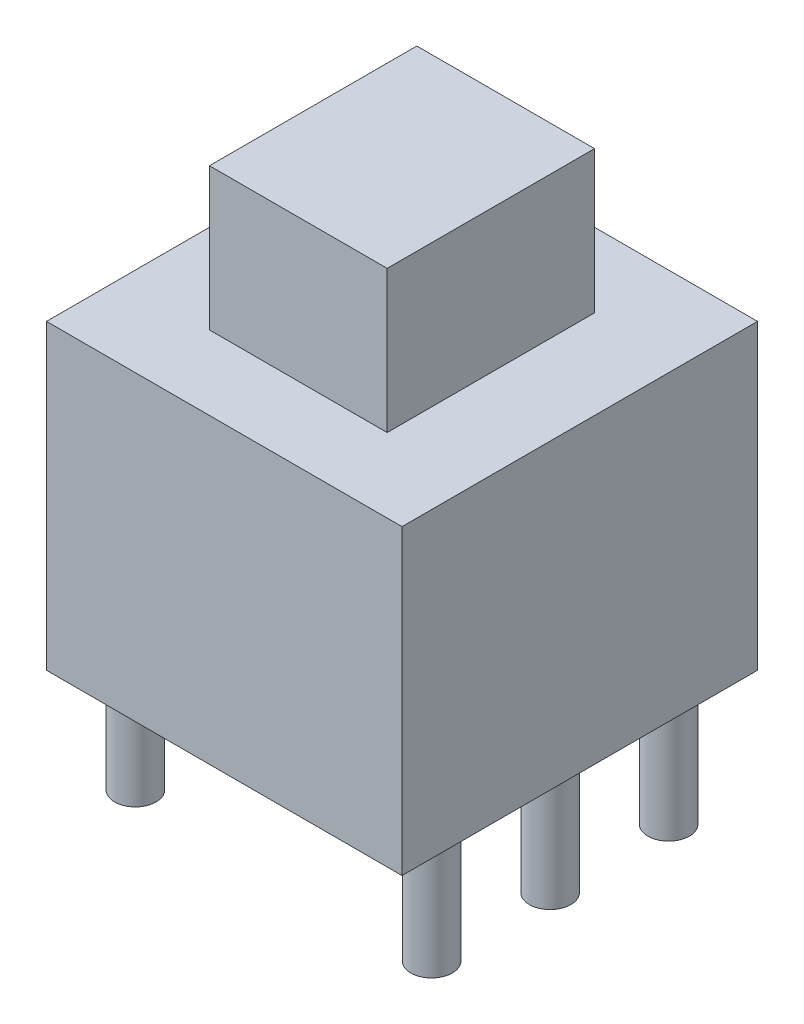
ISO-10303-21;
HEADER;
FILE_DESCRIPTION(('STEP AP214'),'2;1');
FILE_NAME('part.step','',(''),(''),'','','');
FILE_SCHEMA(('AUTOMOTIVE_DESIGN { 1 0 10303 214 1 1 1 1 }'));
ENDSEC;
DATA;
#1=APPLICATION_CONTEXT('core data for automotive mechanical design processes');
#2=APPLICATION_PROTOCOL_DEFINITION('international standard','automotive_design',2000,#1);
#3=PRODUCT_CONTEXT('',#1,'mechanical');
#4=PRODUCT('Part','Part','',(#3));
#5=PRODUCT_RELATED_PRODUCT_CATEGORY('part','',(#4));
#6=PRODUCT_DEFINITION_FORMATION('','',#4);
#7=PRODUCT_DEFINITION_CONTEXT('part definition',#1,'design');
#8=PRODUCT_DEFINITION('design','',#6,#7);
#9=PRODUCT_DEFINITION_SHAPE('','',#8);
#10=(LENGTH_UNIT() NAMED_UNIT(*) SI_UNIT(.MILLI.,.METRE.));
#11=(NAMED_UNIT(*) PLANE_ANGLE_UNIT() SI_UNIT($,.RADIAN.));
#12=(NAMED_UNIT(*) SI_UNIT($,.STERADIAN.) SOLID_ANGLE_UNIT());
#13=UNCERTAINTY_MEASURE_WITH_UNIT(LENGTH_MEASURE(1.E-05),#10,'distance_accuracy_value','');
#14=(GEOMETRIC_REPRESENTATION_CONTEXT(3) GLOBAL_UNCERTAINTY_ASSIGNED_CONTEXT((#13)) GLOBAL_UNIT_ASSIGNED_CONTEXT((#10,
#11,#12)) REPRESENTATION_CONTEXT('',''));
#15=CARTESIAN_POINT('',(0.,0.,0.));
#16=DIRECTION('',(0.,0.,1.));
#17=DIRECTION('',(1.,0.,0.));
#18=AXIS2_PLACEMENT_3D('',#15,#16,#17);
#19=CARTESIAN_POINT('',(0.,5.1,0.));
#20=DIRECTION('',(0.,-1.,0.));
#21=DIRECTION('',(0.,0.,-1.));
#22=AXIS2_PLACEMENT_3D('',#19,#20,#21);
#23=PLANE('',#22);
#24=DIRECTION('',(0.,0.,-1.));
#25=VECTOR('',#24,1.);
#26=CARTESIAN_POINT('',(3.,5.1,3.));
#27=LINE('',#26,#25);
#28=CARTESIAN_POINT('',(3.,5.1,3.));
#29=VERTEX_POINT('',#28);
#30=CARTESIAN_POINT('',(3.,5.1,-3.));
#31=VERTEX_POINT('',#30);
#32=EDGE_CURVE('E143',#29,#31,#27,.T.);
#33=ORIENTED_EDGE('',*,*,#32,.T.);
#34=DIRECTION('',(-1.,0.,0.));
#35=VECTOR('',#34,1.);
#36=CARTESIAN_POINT('',(-3.,5.1,-3.));
#37=LINE('',#36,#35);
#38=CARTESIAN_POINT('',(-3.,5.1,-3.));
#39=VERTEX_POINT('',#38);
#40=EDGE_CURVE('E147',#31,#39,#37,.T.);
#41=ORIENTED_EDGE('',*,*,#40,.T.);
#42=DIRECTION('',(0.,0.,1.));
#43=VECTOR('',#42,1.);
#44=CARTESIAN_POINT('',(-3.,5.1,3.));
#45=LINE('',#44,#43);
#46=CARTESIAN_POINT('',(-3.,5.1,3.));
#47=VERTEX_POINT('',#46);
#48=EDGE_CURVE('E151',#39,#47,#45,.T.);
#49=ORIENTED_EDGE('',*,*,#48,.T.);
#50=DIRECTION('',(1.,0.,0.));
#51=VECTOR('',#50,1.);
#52=CARTESIAN_POINT('',(-3.,5.1,3.));
#53=LINE('',#52,#51);
#54=EDGE_CURVE('E154',#47,#29,#53,.T.);
#55=ORIENTED_EDGE('',*,*,#54,.T.);
#56=EDGE_LOOP('',(#33,#41,#49,#55));
#57=FACE_BOUND('',#56,.T.);
#58=DIRECTION('',(0.,0.,-1.));
#59=VECTOR('',#58,1.);
#60=CARTESIAN_POINT('',(1.5,5.1,1.75));
#61=LINE('',#60,#59);
#62=CARTESIAN_POINT('',(1.5,5.1,1.75));
#63=VERTEX_POINT('',#62);
#64=CARTESIAN_POINT('',(1.5,5.1,-1.75000000000001));
#65=VERTEX_POINT('',#64);
#66=EDGE_CURVE('E59',#63,#65,#61,.T.);
#67=ORIENTED_EDGE('',*,*,#66,.F.);
#68=DIRECTION('',(1.,0.,0.));
#69=VECTOR('',#68,1.);
#70=CARTESIAN_POINT('',(-1.5,5.1,1.75));
#71=LINE('',#70,#69);
#72=CARTESIAN_POINT('',(-1.5,5.1,1.75));
#73=VERTEX_POINT('',#72);
#74=EDGE_CURVE('E63',#73,#63,#71,.T.);
#75=ORIENTED_EDGE('',*,*,#74,.F.);
#76=DIRECTION('',(0.,0.,1.));
#77=VECTOR('',#76,1.);
#78=CARTESIAN_POINT('',(-1.5,5.1,1.75));
#79=LINE('',#78,#77);
#80=CARTESIAN_POINT('',(-1.5,5.1,-1.75000000000001));
#81=VERTEX_POINT('',#80);
#82=EDGE_CURVE('E510',#81,#73,#79,.T.);
#83=ORIENTED_EDGE('',*,*,#82,.F.);
#84=DIRECTION('',(-1.,0.,0.));
#85=VECTOR('',#84,1.);
#86=CARTESIAN_POINT('',(-1.5,5.1,-1.75000000000001));
#87=LINE('',#86,#85);
#88=EDGE_CURVE('E507',#65,#81,#87,.T.);
#89=ORIENTED_EDGE('',*,*,#88,.F.);
#90=EDGE_LOOP('',(#67,#75,#83,#89));
#91=FACE_BOUND('',#90,.T.);
#92=ADVANCED_FACE('F43',(#57,#91),#23,.F.);
#93=CARTESIAN_POINT('',(3.,5.1,3.));
#94=DIRECTION('',(-1.,0.,0.));
#95=DIRECTION('',(0.,0.,1.));
#96=AXIS2_PLACEMENT_3D('',#93,#94,#95);
#97=PLANE('',#96);
#98=DIRECTION('',(0.,0.,-1.));
#99=VECTOR('',#98,1.);
#100=CARTESIAN_POINT('',(3.,0.,3.));
#101=LINE('',#100,#99);
#102=CARTESIAN_POINT('',(3.,0.,3.));
#103=VERTEX_POINT('',#102);
#104=CARTESIAN_POINT('',(3.,0.,-3.));
#105=VERTEX_POINT('',#104);
#106=EDGE_CURVE('E132',#103,#105,#101,.T.);
#107=ORIENTED_EDGE('',*,*,#106,.T.);
#108=DIRECTION('',(0.,-1.,0.));
#109=VECTOR('',#108,1.);
#110=CARTESIAN_POINT('',(3.,5.1,-3.));
#111=LINE('',#110,#109);
#112=EDGE_CURVE('E11',#31,#105,#111,.T.);
#113=ORIENTED_EDGE('',*,*,#112,.F.);
#114=ORIENTED_EDGE('',*,*,#32,.F.);
#115=DIRECTION('',(0.,-1.,0.));
#116=VECTOR('',#115,1.);
#117=CARTESIAN_POINT('',(3.,5.1,3.));
#118=LINE('',#117,#116);
#119=EDGE_CURVE('E156',#29,#103,#118,.T.);
#120=ORIENTED_EDGE('',*,*,#119,.T.);
#121=EDGE_LOOP('',(#107,#113,#114,#120));
#122=FACE_BOUND('',#121,.T.);
#123=ADVANCED_FACE('F45',(#122),#97,.F.);
#124=CARTESIAN_POINT('',(-3.,5.1,-3.));
#125=DIRECTION('',(0.,0.,1.));
#126=DIRECTION('',(1.,0.,0.));
#127=AXIS2_PLACEMENT_3D('',#124,#125,#126);
#128=PLANE('',#127);
#129=DIRECTION('',(-1.,0.,0.));
#130=VECTOR('',#129,1.);
#131=CARTESIAN_POINT('',(-3.,0.,-3.));
#132=LINE('',#131,#130);
#133=CARTESIAN_POINT('',(-3.,0.,-3.));
#134=VERTEX_POINT('',#133);
#135=EDGE_CURVE('E137',#105,#134,#132,.T.);
#136=ORIENTED_EDGE('',*,*,#135,.T.);
#137=DIRECTION('',(0.,-1.,0.));
#138=VECTOR('',#137,1.);
#139=CARTESIAN_POINT('',(-3.,5.1,-3.));
#140=LINE('',#139,#138);
#141=EDGE_CURVE('E52',#39,#134,#140,.T.);
#142=ORIENTED_EDGE('',*,*,#141,.F.);
#143=ORIENTED_EDGE('',*,*,#40,.F.);
#144=ORIENTED_EDGE('',*,*,#112,.T.);
#145=EDGE_LOOP('',(#136,#142,#143,#144));
#146=FACE_BOUND('',#145,.T.);
#147=ADVANCED_FACE('F192',(#146),#128,.F.);
#148=CARTESIAN_POINT('',(-3.,5.1,3.));
#149=DIRECTION('',(1.,0.,0.));
#150=DIRECTION('',(0.,0.,-1.));
#151=AXIS2_PLACEMENT_3D('',#148,#149,#150);
#152=PLANE('',#151);
#153=DIRECTION('',(0.,0.,1.));
#154=VECTOR('',#153,1.);
#155=CARTESIAN_POINT('',(-3.,0.,3.));
#156=LINE('',#155,#154);
#157=CARTESIAN_POINT('',(-3.,0.,3.));
#158=VERTEX_POINT('',#157);
#159=EDGE_CURVE('E160',#134,#158,#156,.T.);
#160=ORIENTED_EDGE('',*,*,#159,.T.);
#161=DIRECTION('',(0.,-1.,0.));
#162=VECTOR('',#161,1.);
#163=CARTESIAN_POINT('',(-3.,5.1,3.));
#164=LINE('',#163,#162);
#165=EDGE_CURVE('E168',#47,#158,#164,.T.);
#166=ORIENTED_EDGE('',*,*,#165,.F.);
#167=ORIENTED_EDGE('',*,*,#48,.F.);
#168=ORIENTED_EDGE('',*,*,#141,.T.);
#169=EDGE_LOOP('',(#160,#166,#167,#168));
#170=FACE_BOUND('',#169,.T.);
#171=ADVANCED_FACE('F177',(#170),#152,.F.);
#172=CARTESIAN_POINT('',(-3.,5.1,3.));
#173=DIRECTION('',(0.,0.,-1.));
#174=DIRECTION('',(-1.,0.,0.));
#175=AXIS2_PLACEMENT_3D('',#172,#173,#174);
#176=PLANE('',#175);
#177=DIRECTION('',(1.,0.,0.));
#178=VECTOR('',#177,1.);
#179=CARTESIAN_POINT('',(-3.,0.,3.));
#180=LINE('',#179,#178);
#181=EDGE_CURVE('E148',#158,#103,#180,.T.);
#182=ORIENTED_EDGE('',*,*,#181,.T.);
#183=ORIENTED_EDGE('',*,*,#119,.F.);
#184=ORIENTED_EDGE('',*,*,#54,.F.);
#185=ORIENTED_EDGE('',*,*,#165,.T.);
#186=EDGE_LOOP('',(#182,#183,#184,#185));
#187=FACE_BOUND('',#186,.T.);
#188=ADVANCED_FACE('F186',(#187),#176,.F.);
#189=CARTESIAN_POINT('',(0.,0.,0.));
#190=DIRECTION('',(0.,-1.,0.));
#191=DIRECTION('',(0.,0.,-1.));
#192=AXIS2_PLACEMENT_3D('',#189,#190,#191);
#193=PLANE('',#192);
#194=CARTESIAN_POINT('',(2.5,0.,2.));
#195=DIRECTION('',(0.,-1.,0.));
#196=DIRECTION('',(0.,0.,1.));
#197=AXIS2_PLACEMENT_3D('',#194,#195,#196);
#198=CIRCLE('',#197,0.35);
#199=CARTESIAN_POINT('',(2.5,0.,2.35));
#200=VERTEX_POINT('',#199);
#201=EDGE_CURVE('E454',#200,#200,#198,.T.);
#202=ORIENTED_EDGE('',*,*,#201,.F.);
#203=EDGE_LOOP('',(#202));
#204=FACE_BOUND('',#203,.T.);
#205=CARTESIAN_POINT('',(2.5,0.,0.));
#206=DIRECTION('',(0.,-1.,0.));
#207=DIRECTION('',(0.,0.,1.));
#208=AXIS2_PLACEMENT_3D('',#205,#206,#207);
#209=CIRCLE('',#208,0.349999999999999);
#210=CARTESIAN_POINT('',(2.5,0.,0.349999999999999));
#211=VERTEX_POINT('',#210);
#212=EDGE_CURVE('E461',#211,#211,#209,.T.);
#213=ORIENTED_EDGE('',*,*,#212,.F.);
#214=EDGE_LOOP('',(#213));
#215=FACE_BOUND('',#214,.T.);
#216=CARTESIAN_POINT('',(2.5,0.,-2.));
#217=DIRECTION('',(0.,-1.,0.));
#218=DIRECTION('',(0.,0.,1.));
#219=AXIS2_PLACEMENT_3D('',#216,#217,#218);
#220=CIRCLE('',#219,0.35);
#221=CARTESIAN_POINT('',(2.5,0.,-1.65));
#222=VERTEX_POINT('',#221);
#223=EDGE_CURVE('E469',#222,#222,#220,.T.);
#224=ORIENTED_EDGE('',*,*,#223,.F.);
#225=EDGE_LOOP('',(#224));
#226=FACE_BOUND('',#225,.T.);
#227=CARTESIAN_POINT('',(-2.5,0.,2.));
#228=DIRECTION('',(0.,-1.,0.));
#229=DIRECTION('',(0.,0.,-1.));
#230=AXIS2_PLACEMENT_3D('',#227,#228,#229);
#231=CIRCLE('',#230,0.35);
#232=CARTESIAN_POINT('',(-2.5,0.,1.65));
#233=VERTEX_POINT('',#232);
#234=EDGE_CURVE('E477',#233,#233,#231,.T.);
#235=ORIENTED_EDGE('',*,*,#234,.F.);
#236=EDGE_LOOP('',(#235));
#237=FACE_BOUND('',#236,.T.);
#238=CARTESIAN_POINT('',(-2.5,0.,-2.));
#239=DIRECTION('',(0.,-1.,0.));
#240=DIRECTION('',(0.,0.,-1.));
#241=AXIS2_PLACEMENT_3D('',#238,#239,#240);
#242=CIRCLE('',#241,0.35);
#243=CARTESIAN_POINT('',(-2.5,0.,-2.35));
#244=VERTEX_POINT('',#243);
#245=EDGE_CURVE('E485',#244,#244,#242,.T.);
#246=ORIENTED_EDGE('',*,*,#245,.F.);
#247=EDGE_LOOP('',(#246));
#248=FACE_BOUND('',#247,.T.);
#249=CARTESIAN_POINT('',(-2.5,0.,0.));
#250=DIRECTION('',(0.,-1.,0.));
#251=DIRECTION('',(0.,0.,-1.));
#252=AXIS2_PLACEMENT_3D('',#249,#250,#251);
#253=CIRCLE('',#252,0.35);
#254=CARTESIAN_POINT('',(-2.5,0.,-0.35));
#255=VERTEX_POINT('',#254);
#256=EDGE_CURVE('E489',#255,#255,#253,.T.);
#257=ORIENTED_EDGE('',*,*,#256,.F.);
#258=EDGE_LOOP('',(#257));
#259=FACE_BOUND('',#258,.T.);
#260=ORIENTED_EDGE('',*,*,#106,.F.);
#261=ORIENTED_EDGE('',*,*,#181,.F.);
#262=ORIENTED_EDGE('',*,*,#159,.F.);
#263=ORIENTED_EDGE('',*,*,#135,.F.);
#264=EDGE_LOOP('',(#260,#261,#262,#263));
#265=FACE_BOUND('',#264,.T.);
#266=ADVANCED_FACE('F183',(#204,#215,#226,#237,#248,#259,#265),#193,.T.);
#267=CARTESIAN_POINT('',(1.5,7.5,1.75));
#268=DIRECTION('',(-1.,0.,0.));
#269=DIRECTION('',(0.,0.,1.));
#270=AXIS2_PLACEMENT_3D('',#267,#268,#269);
#271=PLANE('',#270);
#272=ORIENTED_EDGE('',*,*,#66,.T.);
#273=DIRECTION('',(0.,-1.,0.));
#274=VECTOR('',#273,1.);
#275=CARTESIAN_POINT('',(1.5,7.5,-1.75000000000001));
#276=LINE('',#275,#274);
#277=CARTESIAN_POINT('',(1.5,7.5,-1.75000000000001));
#278=VERTEX_POINT('',#277);
#279=EDGE_CURVE('E112',#278,#65,#276,.T.);
#280=ORIENTED_EDGE('',*,*,#279,.F.);
#281=DIRECTION('',(0.,0.,-1.));
#282=VECTOR('',#281,1.);
#283=CARTESIAN_POINT('',(1.5,7.5,1.75));
#284=LINE('',#283,#282);
#285=CARTESIAN_POINT('',(1.5,7.5,1.75));
#286=VERTEX_POINT('',#285);
#287=EDGE_CURVE('E119',#286,#278,#284,.T.);
#288=ORIENTED_EDGE('',*,*,#287,.F.);
#289=DIRECTION('',(0.,-1.,0.));
#290=VECTOR('',#289,1.);
#291=CARTESIAN_POINT('',(1.5,7.5,1.75));
#292=LINE('',#291,#290);
#293=EDGE_CURVE('E504',#286,#63,#292,.T.);
#294=ORIENTED_EDGE('',*,*,#293,.T.);
#295=EDGE_LOOP('',(#272,#280,#288,#294));
#296=FACE_BOUND('',#295,.T.);
#297=ADVANCED_FACE('F130',(#296),#271,.F.);
#298=CARTESIAN_POINT('',(-1.5,7.5,-1.75000000000001));
#299=DIRECTION('',(0.,0.,1.));
#300=DIRECTION('',(1.,0.,0.));
#301=AXIS2_PLACEMENT_3D('',#298,#299,#300);
#302=PLANE('',#301);
#303=ORIENTED_EDGE('',*,*,#88,.T.);
#304=DIRECTION('',(0.,-1.,0.));
#305=VECTOR('',#304,1.);
#306=CARTESIAN_POINT('',(-1.5,7.5,-1.75000000000001));
#307=LINE('',#306,#305);
#308=CARTESIAN_POINT('',(-1.5,7.5,-1.75000000000001));
#309=VERTEX_POINT('',#308);
#310=EDGE_CURVE('E114',#309,#81,#307,.T.);
#311=ORIENTED_EDGE('',*,*,#310,.F.);
#312=DIRECTION('',(-1.,0.,0.));
#313=VECTOR('',#312,1.);
#314=CARTESIAN_POINT('',(-1.5,7.5,-1.75000000000001));
#315=LINE('',#314,#313);
#316=EDGE_CURVE('E107',#278,#309,#315,.T.);
#317=ORIENTED_EDGE('',*,*,#316,.F.);
#318=ORIENTED_EDGE('',*,*,#279,.T.);
#319=EDGE_LOOP('',(#303,#311,#317,#318));
#320=FACE_BOUND('',#319,.T.);
#321=ADVANCED_FACE('F110',(#320),#302,.F.);
#322=CARTESIAN_POINT('',(-1.5,7.5,1.75));
#323=DIRECTION('',(1.,0.,0.));
#324=DIRECTION('',(0.,0.,-1.));
#325=AXIS2_PLACEMENT_3D('',#322,#323,#324);
#326=PLANE('',#325);
#327=ORIENTED_EDGE('',*,*,#82,.T.);
#328=DIRECTION('',(0.,-1.,0.));
#329=VECTOR('',#328,1.);
#330=CARTESIAN_POINT('',(-1.5,7.5,1.75));
#331=LINE('',#330,#329);
#332=CARTESIAN_POINT('',(-1.5,7.5,1.75));
#333=VERTEX_POINT('',#332);
#334=EDGE_CURVE('E139',#333,#73,#331,.T.);
#335=ORIENTED_EDGE('',*,*,#334,.F.);
#336=DIRECTION('',(0.,0.,1.));
#337=VECTOR('',#336,1.);
#338=CARTESIAN_POINT('',(-1.5,7.5,1.75));
#339=LINE('',#338,#337);
#340=EDGE_CURVE('E118',#309,#333,#339,.T.);
#341=ORIENTED_EDGE('',*,*,#340,.F.);
#342=ORIENTED_EDGE('',*,*,#310,.T.);
#343=EDGE_LOOP('',(#327,#335,#341,#342));
#344=FACE_BOUND('',#343,.T.);
#345=ADVANCED_FACE('F231',(#344),#326,.F.);
#346=CARTESIAN_POINT('',(-1.5,7.5,1.75));
#347=DIRECTION('',(0.,0.,-1.));
#348=DIRECTION('',(-1.,0.,0.));
#349=AXIS2_PLACEMENT_3D('',#346,#347,#348);
#350=PLANE('',#349);
#351=ORIENTED_EDGE('',*,*,#74,.T.);
#352=ORIENTED_EDGE('',*,*,#293,.F.);
#353=DIRECTION('',(1.,0.,0.));
#354=VECTOR('',#353,1.);
#355=CARTESIAN_POINT('',(-1.5,7.5,1.75));
#356=LINE('',#355,#354);
#357=EDGE_CURVE('E124',#333,#286,#356,.T.);
#358=ORIENTED_EDGE('',*,*,#357,.F.);
#359=ORIENTED_EDGE('',*,*,#334,.T.);
#360=EDGE_LOOP('',(#351,#352,#358,#359));
#361=FACE_BOUND('',#360,.T.);
#362=ADVANCED_FACE('F237',(#361),#350,.F.);
#363=CARTESIAN_POINT('',(0.,7.5,0.));
#364=DIRECTION('',(0.,-1.,0.));
#365=DIRECTION('',(0.,0.,-1.));
#366=AXIS2_PLACEMENT_3D('',#363,#364,#365);
#367=PLANE('',#366);
#368=ORIENTED_EDGE('',*,*,#287,.T.);
#369=ORIENTED_EDGE('',*,*,#316,.T.);
#370=ORIENTED_EDGE('',*,*,#340,.T.);
#371=ORIENTED_EDGE('',*,*,#357,.T.);
#372=EDGE_LOOP('',(#368,#369,#370,#371));
#373=FACE_BOUND('',#372,.T.);
#374=ADVANCED_FACE('F122',(#373),#367,.F.);
#375=CARTESIAN_POINT('',(-2.5,-2.,0.));
#376=DIRECTION('',(0.,1.,0.));
#377=DIRECTION('',(0.,0.,1.));
#378=AXIS2_PLACEMENT_3D('',#375,#376,#377);
#379=CYLINDRICAL_SURFACE('',#378,0.35);
#380=CARTESIAN_POINT('',(-2.5,-2.,0.));
#381=DIRECTION('',(0.,-1.,0.));
#382=DIRECTION('',(0.,0.,-1.));
#383=AXIS2_PLACEMENT_3D('',#380,#381,#382);
#384=CIRCLE('',#383,0.35);
#385=CARTESIAN_POINT('',(-2.5,-2.,-0.35));
#386=VERTEX_POINT('',#385);
#387=EDGE_CURVE('E493',#386,#386,#384,.T.);
#388=ORIENTED_EDGE('',*,*,#387,.F.);
#389=EDGE_LOOP('',(#388));
#390=FACE_BOUND('',#389,.T.);
#391=ORIENTED_EDGE('',*,*,#256,.T.);
#392=EDGE_LOOP('',(#391));
#393=FACE_BOUND('',#392,.T.);
#394=ADVANCED_FACE('F251',(#390,#393),#379,.T.);
#395=CARTESIAN_POINT('',(-2.5,-2.,0.));
#396=DIRECTION('',(0.,-1.,0.));
#397=DIRECTION('',(0.,0.,-1.));
#398=AXIS2_PLACEMENT_3D('',#395,#396,#397);
#399=PLANE('',#398);
#400=ORIENTED_EDGE('',*,*,#387,.T.);
#401=EDGE_LOOP('',(#400));
#402=FACE_BOUND('',#401,.T.);
#403=ADVANCED_FACE('F257',(#402),#399,.T.);
#404=CARTESIAN_POINT('',(-2.5,-2.,-2.));
#405=DIRECTION('',(0.,1.,0.));
#406=DIRECTION('',(0.,0.,1.));
#407=AXIS2_PLACEMENT_3D('',#404,#405,#406);
#408=CYLINDRICAL_SURFACE('',#407,0.35);
#409=CARTESIAN_POINT('',(-2.5,-2.,-2.));
#410=DIRECTION('',(0.,-1.,0.));
#411=DIRECTION('',(0.,0.,-1.));
#412=AXIS2_PLACEMENT_3D('',#409,#410,#411);
#413=CIRCLE('',#412,0.35);
#414=CARTESIAN_POINT('',(-2.5,-2.,-2.35));
#415=VERTEX_POINT('',#414);
#416=EDGE_CURVE('E481',#415,#415,#413,.T.);
#417=ORIENTED_EDGE('',*,*,#416,.F.);
#418=EDGE_LOOP('',(#417));
#419=FACE_BOUND('',#418,.T.);
#420=ORIENTED_EDGE('',*,*,#245,.T.);
#421=EDGE_LOOP('',(#420));
#422=FACE_BOUND('',#421,.T.);
#423=ADVANCED_FACE('F265',(#419,#422),#408,.T.);
#424=CARTESIAN_POINT('',(-2.5,-2.,-2.));
#425=DIRECTION('',(0.,-1.,0.));
#426=DIRECTION('',(0.,0.,-1.));
#427=AXIS2_PLACEMENT_3D('',#424,#425,#426);
#428=PLANE('',#427);
#429=ORIENTED_EDGE('',*,*,#416,.T.);
#430=EDGE_LOOP('',(#429));
#431=FACE_BOUND('',#430,.T.);
#432=ADVANCED_FACE('F273',(#431),#428,.T.);
#433=CARTESIAN_POINT('',(-2.5,-2.,2.));
#434=DIRECTION('',(0.,1.,0.));
#435=DIRECTION('',(0.,0.,1.));
#436=AXIS2_PLACEMENT_3D('',#433,#434,#435);
#437=CYLINDRICAL_SURFACE('',#436,0.35);
#438=CARTESIAN_POINT('',(-2.5,-2.,2.));
#439=DIRECTION('',(0.,-1.,0.));
#440=DIRECTION('',(0.,0.,-1.));
#441=AXIS2_PLACEMENT_3D('',#438,#439,#440);
#442=CIRCLE('',#441,0.35);
#443=CARTESIAN_POINT('',(-2.5,-2.,1.65));
#444=VERTEX_POINT('',#443);
#445=EDGE_CURVE('E473',#444,#444,#442,.T.);
#446=ORIENTED_EDGE('',*,*,#445,.F.);
#447=EDGE_LOOP('',(#446));
#448=FACE_BOUND('',#447,.T.);
#449=ORIENTED_EDGE('',*,*,#234,.T.);
#450=EDGE_LOOP('',(#449));
#451=FACE_BOUND('',#450,.T.);
#452=ADVANCED_FACE('F281',(#448,#451),#437,.T.);
#453=CARTESIAN_POINT('',(-2.5,-2.,2.));
#454=DIRECTION('',(0.,-1.,0.));
#455=DIRECTION('',(0.,0.,-1.));
#456=AXIS2_PLACEMENT_3D('',#453,#454,#455);
#457=PLANE('',#456);
#458=ORIENTED_EDGE('',*,*,#445,.T.);
#459=EDGE_LOOP('',(#458));
#460=FACE_BOUND('',#459,.T.);
#461=ADVANCED_FACE('F289',(#460),#457,.T.);
#462=CARTESIAN_POINT('',(2.5,-2.,-2.));
#463=DIRECTION('',(0.,1.,0.));
#464=DIRECTION('',(0.,0.,1.));
#465=AXIS2_PLACEMENT_3D('',#462,#463,#464);
#466=CYLINDRICAL_SURFACE('',#465,0.35);
#467=CARTESIAN_POINT('',(2.5,-2.,-2.));
#468=DIRECTION('',(0.,-1.,0.));
#469=DIRECTION('',(0.,0.,1.));
#470=AXIS2_PLACEMENT_3D('',#467,#468,#469);
#471=CIRCLE('',#470,0.35);
#472=CARTESIAN_POINT('',(2.5,-2.,-1.65));
#473=VERTEX_POINT('',#472);
#474=EDGE_CURVE('E465',#473,#473,#471,.T.);
#475=ORIENTED_EDGE('',*,*,#474,.F.);
#476=EDGE_LOOP('',(#475));
#477=FACE_BOUND('',#476,.T.);
#478=ORIENTED_EDGE('',*,*,#223,.T.);
#479=EDGE_LOOP('',(#478));
#480=FACE_BOUND('',#479,.T.);
#481=ADVANCED_FACE('F297',(#477,#480),#466,.T.);
#482=CARTESIAN_POINT('',(2.5,-2.,-2.));
#483=DIRECTION('',(0.,1.,0.));
#484=DIRECTION('',(0.,0.,1.));
#485=AXIS2_PLACEMENT_3D('',#482,#483,#484);
#486=PLANE('',#485);
#487=ORIENTED_EDGE('',*,*,#474,.T.);
#488=EDGE_LOOP('',(#487));
#489=FACE_BOUND('',#488,.T.);
#490=ADVANCED_FACE('F305',(#489),#486,.F.);
#491=CARTESIAN_POINT('',(2.5,-2.,0.));
#492=DIRECTION('',(0.,1.,0.));
#493=DIRECTION('',(0.,0.,1.));
#494=AXIS2_PLACEMENT_3D('',#491,#492,#493);
#495=CYLINDRICAL_SURFACE('',#494,0.349999999999999);
#496=CARTESIAN_POINT('',(2.5,-2.,0.));
#497=DIRECTION('',(0.,-1.,0.));
#498=DIRECTION('',(0.,0.,1.));
#499=AXIS2_PLACEMENT_3D('',#496,#497,#498);
#500=CIRCLE('',#499,0.349999999999999);
#501=CARTESIAN_POINT('',(2.5,-2.,0.349999999999999));
#502=VERTEX_POINT('',#501);
#503=EDGE_CURVE('E458',#502,#502,#500,.T.);
#504=ORIENTED_EDGE('',*,*,#503,.F.);
#505=EDGE_LOOP('',(#504));
#506=FACE_BOUND('',#505,.T.);
#507=ORIENTED_EDGE('',*,*,#212,.T.);
#508=EDGE_LOOP('',(#507));
#509=FACE_BOUND('',#508,.T.);
#510=ADVANCED_FACE('F313',(#506,#509),#495,.T.);
#511=CARTESIAN_POINT('',(2.5,-2.,0.));
#512=DIRECTION('',(0.,1.,0.));
#513=DIRECTION('',(0.,0.,1.));
#514=AXIS2_PLACEMENT_3D('',#511,#512,#513);
#515=PLANE('',#514);
#516=ORIENTED_EDGE('',*,*,#503,.T.);
#517=EDGE_LOOP('',(#516));
#518=FACE_BOUND('',#517,.T.);
#519=ADVANCED_FACE('F321',(#518),#515,.F.);
#520=CARTESIAN_POINT('',(2.5,-2.,2.));
#521=DIRECTION('',(0.,1.,0.));
#522=DIRECTION('',(0.,0.,1.));
#523=AXIS2_PLACEMENT_3D('',#520,#521,#522);
#524=CYLINDRICAL_SURFACE('',#523,0.35);
#525=CARTESIAN_POINT('',(2.5,-2.,2.));
#526=DIRECTION('',(0.,-1.,0.));
#527=DIRECTION('',(0.,0.,1.));
#528=AXIS2_PLACEMENT_3D('',#525,#526,#527);
#529=CIRCLE('',#528,0.35);
#530=CARTESIAN_POINT('',(2.5,-2.,2.35));
#531=VERTEX_POINT('',#530);
#532=EDGE_CURVE('E452',#531,#531,#529,.T.);
#533=ORIENTED_EDGE('',*,*,#532,.F.);
#534=EDGE_LOOP('',(#533));
#535=FACE_BOUND('',#534,.T.);
#536=ORIENTED_EDGE('',*,*,#201,.T.);
#537=EDGE_LOOP('',(#536));
#538=FACE_BOUND('',#537,.T.);
#539=ADVANCED_FACE('F329',(#535,#538),#524,.T.);
#540=CARTESIAN_POINT('',(2.5,-2.,2.));
#541=DIRECTION('',(0.,1.,0.));
#542=DIRECTION('',(0.,0.,1.));
#543=AXIS2_PLACEMENT_3D('',#540,#541,#542);
#544=PLANE('',#543);
#545=ORIENTED_EDGE('',*,*,#532,.T.);
#546=EDGE_LOOP('',(#545));
#547=FACE_BOUND('',#546,.T.);
#548=ADVANCED_FACE('F337',(#547),#544,.F.);
#549=CLOSED_SHELL('',(#92,#123,#147,#171,#188,#266,#297,#321,#345,#362,#374,#394,#403,#423,#432,
#452,#461,#481,#490,#510,#519,#539,#548));
#550=MANIFOLD_SOLID_BREP('B2',#549);
#551=ADVANCED_BREP_SHAPE_REPRESENTATION('',(#18,#550),#14);
#552=SHAPE_DEFINITION_REPRESENTATION(#9,#551);
ENDSEC;
END-ISO-10303-21;
